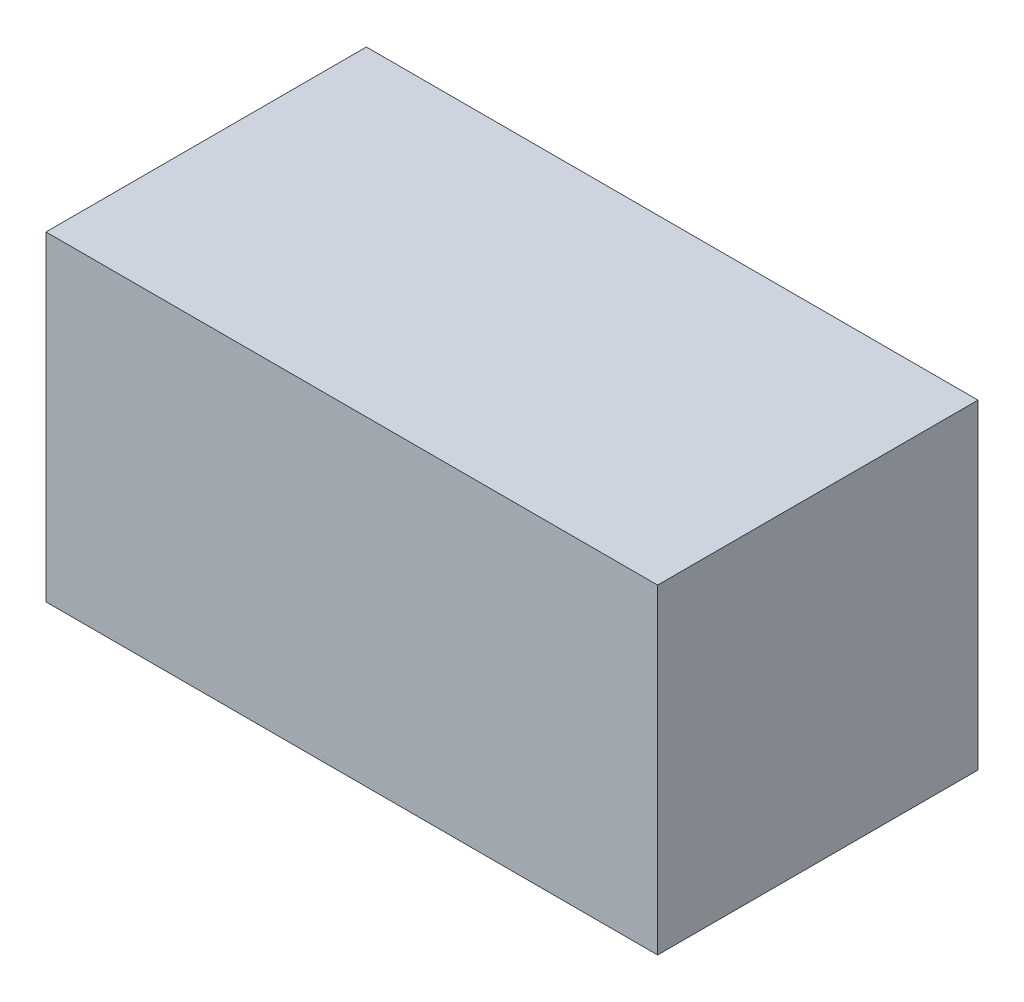
ISO-10303-21;
HEADER;
FILE_DESCRIPTION(('STEP AP214'),'2;1');
FILE_NAME('part.step','',(''),(''),'','','');
FILE_SCHEMA(('AUTOMOTIVE_DESIGN { 1 0 10303 214 1 1 1 1 }'));
ENDSEC;
DATA;
#1=APPLICATION_CONTEXT('core data for automotive mechanical design processes');
#2=APPLICATION_PROTOCOL_DEFINITION('international standard','automotive_design',2000,#1);
#3=PRODUCT_CONTEXT('',#1,'mechanical');
#4=PRODUCT('Part','Part','',(#3));
#5=PRODUCT_RELATED_PRODUCT_CATEGORY('part','',(#4));
#6=PRODUCT_DEFINITION_FORMATION('','',#4);
#7=PRODUCT_DEFINITION_CONTEXT('part definition',#1,'design');
#8=PRODUCT_DEFINITION('design','',#6,#7);
#9=PRODUCT_DEFINITION_SHAPE('','',#8);
#10=(LENGTH_UNIT() NAMED_UNIT(*) SI_UNIT(.MILLI.,.METRE.));
#11=(NAMED_UNIT(*) PLANE_ANGLE_UNIT() SI_UNIT($,.RADIAN.));
#12=(NAMED_UNIT(*) SI_UNIT($,.STERADIAN.) SOLID_ANGLE_UNIT());
#13=UNCERTAINTY_MEASURE_WITH_UNIT(LENGTH_MEASURE(1.E-05),#10,'distance_accuracy_value','');
#14=(GEOMETRIC_REPRESENTATION_CONTEXT(3) GLOBAL_UNCERTAINTY_ASSIGNED_CONTEXT((#13)) GLOBAL_UNIT_ASSIGNED_CONTEXT((#10,
#11,#12)) REPRESENTATION_CONTEXT('',''));
#15=CARTESIAN_POINT('',(0.,0.,0.));
#16=DIRECTION('',(0.,0.,1.));
#17=DIRECTION('',(1.,0.,0.));
#18=AXIS2_PLACEMENT_3D('',#15,#16,#17);
#19=CARTESIAN_POINT('',(-0.52500022,-0.27499818,0.));
#20=DIRECTION('',(0.,1.,0.));
#21=DIRECTION('',(0.,0.,1.));
#22=AXIS2_PLACEMENT_3D('',#19,#20,#21);
#23=PLANE('',#22);
#24=DIRECTION('',(0.,0.,1.));
#25=VECTOR('',#24,1.);
#26=CARTESIAN_POINT('',(0.52500022,-0.27499818,0.));
#27=LINE('',#26,#25);
#28=CARTESIAN_POINT('',(0.52500022,-0.27499818,0.));
#29=VERTEX_POINT('',#28);
#30=CARTESIAN_POINT('',(0.52500022,-0.27499818,0.5499989));
#31=VERTEX_POINT('',#30);
#32=EDGE_CURVE('E19',#29,#31,#27,.T.);
#33=ORIENTED_EDGE('',*,*,#32,.T.);
#34=DIRECTION('',(-1.,0.,0.));
#35=VECTOR('',#34,1.);
#36=CARTESIAN_POINT('',(0.52500022,-0.27499818,0.5499989));
#37=LINE('',#36,#35);
#38=CARTESIAN_POINT('',(-0.52500022,-0.27499818,0.5499989));
#39=VERTEX_POINT('',#38);
#40=EDGE_CURVE('E54',#31,#39,#37,.T.);
#41=ORIENTED_EDGE('',*,*,#40,.T.);
#42=DIRECTION('',(0.,0.,-1.));
#43=VECTOR('',#42,1.);
#44=CARTESIAN_POINT('',(-0.52500022,-0.27499818,0.));
#45=LINE('',#44,#43);
#46=CARTESIAN_POINT('',(-0.52500022,-0.27499818,0.));
#47=VERTEX_POINT('',#46);
#48=EDGE_CURVE('E73',#39,#47,#45,.T.);
#49=ORIENTED_EDGE('',*,*,#48,.T.);
#50=DIRECTION('',(-1.,0.,0.));
#51=VECTOR('',#50,1.);
#52=CARTESIAN_POINT('',(0.52500022,-0.27499818,0.));
#53=LINE('',#52,#51);
#54=EDGE_CURVE('E65',#29,#47,#53,.T.);
#55=ORIENTED_EDGE('',*,*,#54,.F.);
#56=EDGE_LOOP('',(#33,#41,#49,#55));
#57=FACE_BOUND('',#56,.T.);
#58=ADVANCED_FACE('F16',(#57),#23,.F.);
#59=CARTESIAN_POINT('',(0.52500022,-0.27499818,0.));
#60=DIRECTION('',(-1.,0.,0.));
#61=DIRECTION('',(0.,0.,1.));
#62=AXIS2_PLACEMENT_3D('',#59,#60,#61);
#63=PLANE('',#62);
#64=DIRECTION('',(0.,0.,-1.));
#65=VECTOR('',#64,1.);
#66=CARTESIAN_POINT('',(0.52500022,0.27500072,0.));
#67=LINE('',#66,#65);
#68=CARTESIAN_POINT('',(0.52500022,0.27500072,0.));
#69=VERTEX_POINT('',#68);
#70=CARTESIAN_POINT('',(0.52500022,0.27500072,0.5499989));
#71=VERTEX_POINT('',#70);
#72=EDGE_CURVE('E71',#69,#71,#67,.F.);
#73=ORIENTED_EDGE('',*,*,#72,.T.);
#74=DIRECTION('',(0.,1.,0.));
#75=VECTOR('',#74,1.);
#76=CARTESIAN_POINT('',(0.52500022,-0.27499818,0.5499989));
#77=LINE('',#76,#75);
#78=EDGE_CURVE('E61',#71,#31,#77,.F.);
#79=ORIENTED_EDGE('',*,*,#78,.T.);
#80=ORIENTED_EDGE('',*,*,#32,.F.);
#81=DIRECTION('',(0.,1.,0.));
#82=VECTOR('',#81,1.);
#83=CARTESIAN_POINT('',(0.52500022,-0.27499818,0.));
#84=LINE('',#83,#82);
#85=EDGE_CURVE('E79',#69,#29,#84,.F.);
#86=ORIENTED_EDGE('',*,*,#85,.F.);
#87=EDGE_LOOP('',(#73,#79,#80,#86));
#88=FACE_BOUND('',#87,.T.);
#89=ADVANCED_FACE('F70',(#88),#63,.F.);
#90=CARTESIAN_POINT('',(0.52500022,-0.27499818,0.5499989));
#91=DIRECTION('',(0.,0.,-1.));
#92=DIRECTION('',(-1.,0.,0.));
#93=AXIS2_PLACEMENT_3D('',#90,#91,#92);
#94=PLANE('',#93);
#95=DIRECTION('',(1.,0.,0.));
#96=VECTOR('',#95,1.);
#97=CARTESIAN_POINT('',(0.52500022,0.27500072,0.5499989));
#98=LINE('',#97,#96);
#99=CARTESIAN_POINT('',(-0.52500022,0.27500072,0.5499989));
#100=VERTEX_POINT('',#99);
#101=EDGE_CURVE('E82',#71,#100,#98,.F.);
#102=ORIENTED_EDGE('',*,*,#101,.T.);
#103=DIRECTION('',(0.,1.,0.));
#104=VECTOR('',#103,1.);
#105=CARTESIAN_POINT('',(-0.52500022,0.27500072,0.5499989));
#106=LINE('',#105,#104);
#107=EDGE_CURVE('E63',#100,#39,#106,.F.);
#108=ORIENTED_EDGE('',*,*,#107,.T.);
#109=ORIENTED_EDGE('',*,*,#40,.F.);
#110=ORIENTED_EDGE('',*,*,#78,.F.);
#111=EDGE_LOOP('',(#102,#108,#109,#110));
#112=FACE_BOUND('',#111,.T.);
#113=ADVANCED_FACE('F59',(#112),#94,.F.);
#114=CARTESIAN_POINT('',(-0.52500022,0.27500072,0.));
#115=DIRECTION('',(1.,0.,0.));
#116=DIRECTION('',(0.,0.,-1.));
#117=AXIS2_PLACEMENT_3D('',#114,#115,#116);
#118=PLANE('',#117);
#119=ORIENTED_EDGE('',*,*,#48,.F.);
#120=ORIENTED_EDGE('',*,*,#107,.F.);
#121=DIRECTION('',(0.,0.,-1.));
#122=VECTOR('',#121,1.);
#123=CARTESIAN_POINT('',(-0.52500022,0.27500072,0.));
#124=LINE('',#123,#122);
#125=CARTESIAN_POINT('',(-0.52500022,0.27500072,0.));
#126=VERTEX_POINT('',#125);
#127=EDGE_CURVE('E25',#100,#126,#124,.T.);
#128=ORIENTED_EDGE('',*,*,#127,.T.);
#129=DIRECTION('',(0.,1.,0.));
#130=VECTOR('',#129,1.);
#131=CARTESIAN_POINT('',(-0.52500022,-0.27499818,0.));
#132=LINE('',#131,#130);
#133=EDGE_CURVE('E33',#47,#126,#132,.T.);
#134=ORIENTED_EDGE('',*,*,#133,.F.);
#135=EDGE_LOOP('',(#119,#120,#128,#134));
#136=FACE_BOUND('',#135,.T.);
#137=ADVANCED_FACE('F87',(#136),#118,.F.);
#138=CARTESIAN_POINT('',(0.52500022,-0.27499818,0.));
#139=DIRECTION('',(0.,0.,-1.));
#140=DIRECTION('',(-1.,0.,0.));
#141=AXIS2_PLACEMENT_3D('',#138,#139,#140);
#142=PLANE('',#141);
#143=DIRECTION('',(1.,0.,0.));
#144=VECTOR('',#143,1.);
#145=CARTESIAN_POINT('',(0.52500022,0.27500072,0.));
#146=LINE('',#145,#144);
#147=EDGE_CURVE('E11',#126,#69,#146,.T.);
#148=ORIENTED_EDGE('',*,*,#147,.T.);
#149=ORIENTED_EDGE('',*,*,#85,.T.);
#150=ORIENTED_EDGE('',*,*,#54,.T.);
#151=ORIENTED_EDGE('',*,*,#133,.T.);
#152=EDGE_LOOP('',(#148,#149,#150,#151));
#153=FACE_BOUND('',#152,.T.);
#154=ADVANCED_FACE('F90',(#153),#142,.T.);
#155=CARTESIAN_POINT('',(0.52500022,0.27500072,0.));
#156=DIRECTION('',(0.,-1.,0.));
#157=DIRECTION('',(0.,0.,-1.));
#158=AXIS2_PLACEMENT_3D('',#155,#156,#157);
#159=PLANE('',#158);
#160=ORIENTED_EDGE('',*,*,#127,.F.);
#161=ORIENTED_EDGE('',*,*,#101,.F.);
#162=ORIENTED_EDGE('',*,*,#72,.F.);
#163=ORIENTED_EDGE('',*,*,#147,.F.);
#164=EDGE_LOOP('',(#160,#161,#162,#163));
#165=FACE_BOUND('',#164,.T.);
#166=ADVANCED_FACE('F89',(#165),#159,.F.);
#167=CLOSED_SHELL('',(#58,#89,#113,#137,#154,#166));
#168=MANIFOLD_SOLID_BREP('B1',#167);
#169=ADVANCED_BREP_SHAPE_REPRESENTATION('',(#18,#168),#14);
#170=SHAPE_DEFINITION_REPRESENTATION(#9,#169);
ENDSEC;
END-ISO-10303-21;
